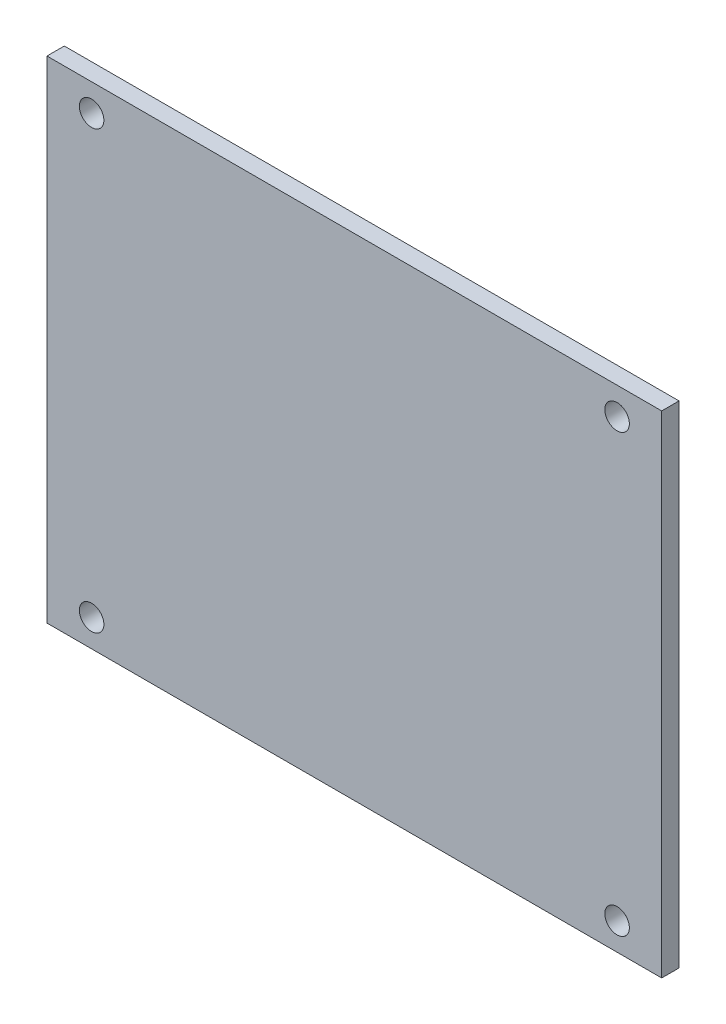
ISO-10303-21;
HEADER;
FILE_DESCRIPTION(('STEP AP214'),'2;1');
FILE_NAME('part.step','',(''),(''),'','','');
FILE_SCHEMA(('AUTOMOTIVE_DESIGN { 1 0 10303 214 1 1 1 1 }'));
ENDSEC;
DATA;
#1=APPLICATION_CONTEXT('core data for automotive mechanical design processes');
#2=APPLICATION_PROTOCOL_DEFINITION('international standard','automotive_design',2000,#1);
#3=PRODUCT_CONTEXT('',#1,'mechanical');
#4=PRODUCT('Part','Part','',(#3));
#5=PRODUCT_RELATED_PRODUCT_CATEGORY('part','',(#4));
#6=PRODUCT_DEFINITION_FORMATION('','',#4);
#7=PRODUCT_DEFINITION_CONTEXT('part definition',#1,'design');
#8=PRODUCT_DEFINITION('design','',#6,#7);
#9=PRODUCT_DEFINITION_SHAPE('','',#8);
#10=(LENGTH_UNIT() NAMED_UNIT(*) SI_UNIT(.MILLI.,.METRE.));
#11=(NAMED_UNIT(*) PLANE_ANGLE_UNIT() SI_UNIT($,.RADIAN.));
#12=(NAMED_UNIT(*) SI_UNIT($,.STERADIAN.) SOLID_ANGLE_UNIT());
#13=UNCERTAINTY_MEASURE_WITH_UNIT(LENGTH_MEASURE(1.E-05),#10,'distance_accuracy_value','');
#14=(GEOMETRIC_REPRESENTATION_CONTEXT(3) GLOBAL_UNCERTAINTY_ASSIGNED_CONTEXT((#13)) GLOBAL_UNIT_ASSIGNED_CONTEXT((#10,
#11,#12)) REPRESENTATION_CONTEXT('',''));
#15=CARTESIAN_POINT('',(0.,0.,0.));
#16=DIRECTION('',(0.,0.,1.));
#17=DIRECTION('',(1.,0.,0.));
#18=AXIS2_PLACEMENT_3D('',#15,#16,#17);
#19=CARTESIAN_POINT('',(0.,0.,3.175));
#20=DIRECTION('',(0.,0.,-1.));
#21=DIRECTION('',(-1.,0.,0.));
#22=AXIS2_PLACEMENT_3D('',#19,#20,#21);
#23=PLANE('',#22);
#24=CARTESIAN_POINT('',(48.15,-40.,3.175));
#25=DIRECTION('',(0.,0.,1.));
#26=DIRECTION('',(1.,0.,0.));
#27=AXIS2_PLACEMENT_3D('',#24,#25,#26);
#28=CIRCLE('',#27,2.24999999999999);
#29=CARTESIAN_POINT('',(50.4,-40.,3.175));
#30=VERTEX_POINT('',#29);
#31=EDGE_CURVE('E147',#30,#30,#28,.T.);
#32=ORIENTED_EDGE('',*,*,#31,.F.);
#33=EDGE_LOOP('',(#32));
#34=FACE_BOUND('',#33,.T.);
#35=CARTESIAN_POINT('',(-48.15,40.,3.175));
#36=DIRECTION('',(0.,0.,1.));
#37=DIRECTION('',(1.,0.,0.));
#38=AXIS2_PLACEMENT_3D('',#35,#36,#37);
#39=CIRCLE('',#38,2.24999999999999);
#40=CARTESIAN_POINT('',(-45.9,40.,3.175));
#41=VERTEX_POINT('',#40);
#42=EDGE_CURVE('E139',#41,#41,#39,.T.);
#43=ORIENTED_EDGE('',*,*,#42,.F.);
#44=EDGE_LOOP('',(#43));
#45=FACE_BOUND('',#44,.T.);
#46=CARTESIAN_POINT('',(-48.15,-40.,3.175));
#47=DIRECTION('',(0.,0.,1.));
#48=DIRECTION('',(1.,0.,0.));
#49=AXIS2_PLACEMENT_3D('',#46,#47,#48);
#50=CIRCLE('',#49,2.24999999999999);
#51=CARTESIAN_POINT('',(-45.9,-40.,3.175));
#52=VERTEX_POINT('',#51);
#53=EDGE_CURVE('E131',#52,#52,#50,.T.);
#54=ORIENTED_EDGE('',*,*,#53,.F.);
#55=EDGE_LOOP('',(#54));
#56=FACE_BOUND('',#55,.T.);
#57=DIRECTION('',(0.,1.,0.));
#58=VECTOR('',#57,1.);
#59=CARTESIAN_POINT('',(56.325,-45.,3.175));
#60=LINE('',#59,#58);
#61=CARTESIAN_POINT('',(56.325,-45.,3.175));
#62=VERTEX_POINT('',#61);
#63=CARTESIAN_POINT('',(56.325,45.,3.175));
#64=VERTEX_POINT('',#63);
#65=EDGE_CURVE('E91',#62,#64,#60,.T.);
#66=ORIENTED_EDGE('',*,*,#65,.T.);
#67=DIRECTION('',(-1.,0.,0.));
#68=VECTOR('',#67,1.);
#69=CARTESIAN_POINT('',(-56.325,45.,3.175));
#70=LINE('',#69,#68);
#71=CARTESIAN_POINT('',(-56.325,45.,3.175));
#72=VERTEX_POINT('',#71);
#73=EDGE_CURVE('E86',#64,#72,#70,.T.);
#74=ORIENTED_EDGE('',*,*,#73,.T.);
#75=DIRECTION('',(0.,-1.,0.));
#76=VECTOR('',#75,1.);
#77=CARTESIAN_POINT('',(-56.325,-45.,3.175));
#78=LINE('',#77,#76);
#79=CARTESIAN_POINT('',(-56.325,-45.,3.175));
#80=VERTEX_POINT('',#79);
#81=EDGE_CURVE('E89',#72,#80,#78,.T.);
#82=ORIENTED_EDGE('',*,*,#81,.T.);
#83=DIRECTION('',(1.,0.,0.));
#84=VECTOR('',#83,1.);
#85=CARTESIAN_POINT('',(-56.325,-45.,3.175));
#86=LINE('',#85,#84);
#87=EDGE_CURVE('E56',#80,#62,#86,.T.);
#88=ORIENTED_EDGE('',*,*,#87,.T.);
#89=EDGE_LOOP('',(#66,#74,#82,#88));
#90=FACE_BOUND('',#89,.T.);
#91=CARTESIAN_POINT('',(48.15,40.,3.175));
#92=DIRECTION('',(0.,0.,1.));
#93=DIRECTION('',(1.,0.,0.));
#94=AXIS2_PLACEMENT_3D('',#91,#92,#93);
#95=CIRCLE('',#94,2.24999999999999);
#96=CARTESIAN_POINT('',(50.4,40.,3.175));
#97=VERTEX_POINT('',#96);
#98=EDGE_CURVE('E155',#97,#97,#95,.T.);
#99=ORIENTED_EDGE('',*,*,#98,.F.);
#100=EDGE_LOOP('',(#99));
#101=FACE_BOUND('',#100,.T.);
#102=ADVANCED_FACE('F38',(#34,#45,#56,#90,#101),#23,.F.);
#103=CARTESIAN_POINT('',(56.325,-45.,3.175));
#104=DIRECTION('',(-1.,0.,0.));
#105=DIRECTION('',(0.,0.,1.));
#106=AXIS2_PLACEMENT_3D('',#103,#104,#105);
#107=PLANE('',#106);
#108=DIRECTION('',(0.,1.,0.));
#109=VECTOR('',#108,1.);
#110=CARTESIAN_POINT('',(56.325,-45.,0.));
#111=LINE('',#110,#109);
#112=CARTESIAN_POINT('',(56.325,-45.,0.));
#113=VERTEX_POINT('',#112);
#114=CARTESIAN_POINT('',(56.325,45.,0.));
#115=VERTEX_POINT('',#114);
#116=EDGE_CURVE('E107',#113,#115,#111,.T.);
#117=ORIENTED_EDGE('',*,*,#116,.T.);
#118=DIRECTION('',(0.,0.,-1.));
#119=VECTOR('',#118,1.);
#120=CARTESIAN_POINT('',(56.325,45.,3.175));
#121=LINE('',#120,#119);
#122=EDGE_CURVE('E11',#64,#115,#121,.T.);
#123=ORIENTED_EDGE('',*,*,#122,.F.);
#124=ORIENTED_EDGE('',*,*,#65,.F.);
#125=DIRECTION('',(0.,0.,-1.));
#126=VECTOR('',#125,1.);
#127=CARTESIAN_POINT('',(56.325,-45.,3.175));
#128=LINE('',#127,#126);
#129=EDGE_CURVE('E103',#62,#113,#128,.T.);
#130=ORIENTED_EDGE('',*,*,#129,.T.);
#131=EDGE_LOOP('',(#117,#123,#124,#130));
#132=FACE_BOUND('',#131,.T.);
#133=ADVANCED_FACE('F40',(#132),#107,.F.);
#134=CARTESIAN_POINT('',(-56.325,45.,3.175));
#135=DIRECTION('',(0.,-1.,0.));
#136=DIRECTION('',(0.,0.,-1.));
#137=AXIS2_PLACEMENT_3D('',#134,#135,#136);
#138=PLANE('',#137);
#139=DIRECTION('',(-1.,0.,0.));
#140=VECTOR('',#139,1.);
#141=CARTESIAN_POINT('',(-56.325,45.,0.));
#142=LINE('',#141,#140);
#143=CARTESIAN_POINT('',(-56.325,45.,0.));
#144=VERTEX_POINT('',#143);
#145=EDGE_CURVE('E96',#115,#144,#142,.T.);
#146=ORIENTED_EDGE('',*,*,#145,.T.);
#147=DIRECTION('',(0.,0.,-1.));
#148=VECTOR('',#147,1.);
#149=CARTESIAN_POINT('',(-56.325,45.,3.175));
#150=LINE('',#149,#148);
#151=EDGE_CURVE('E48',#72,#144,#150,.T.);
#152=ORIENTED_EDGE('',*,*,#151,.F.);
#153=ORIENTED_EDGE('',*,*,#73,.F.);
#154=ORIENTED_EDGE('',*,*,#122,.T.);
#155=EDGE_LOOP('',(#146,#152,#153,#154));
#156=FACE_BOUND('',#155,.T.);
#157=ADVANCED_FACE('F95',(#156),#138,.F.);
#158=CARTESIAN_POINT('',(-56.325,-45.,3.175));
#159=DIRECTION('',(1.,0.,0.));
#160=DIRECTION('',(0.,0.,-1.));
#161=AXIS2_PLACEMENT_3D('',#158,#159,#160);
#162=PLANE('',#161);
#163=DIRECTION('',(0.,-1.,0.));
#164=VECTOR('',#163,1.);
#165=CARTESIAN_POINT('',(-56.325,-45.,0.));
#166=LINE('',#165,#164);
#167=CARTESIAN_POINT('',(-56.325,-45.,0.));
#168=VERTEX_POINT('',#167);
#169=EDGE_CURVE('E73',#144,#168,#166,.T.);
#170=ORIENTED_EDGE('',*,*,#169,.T.);
#171=DIRECTION('',(0.,0.,-1.));
#172=VECTOR('',#171,1.);
#173=CARTESIAN_POINT('',(-56.325,-45.,3.175));
#174=LINE('',#173,#172);
#175=EDGE_CURVE('E98',#80,#168,#174,.T.);
#176=ORIENTED_EDGE('',*,*,#175,.F.);
#177=ORIENTED_EDGE('',*,*,#81,.F.);
#178=ORIENTED_EDGE('',*,*,#151,.T.);
#179=EDGE_LOOP('',(#170,#176,#177,#178));
#180=FACE_BOUND('',#179,.T.);
#181=ADVANCED_FACE('F99',(#180),#162,.F.);
#182=CARTESIAN_POINT('',(-56.325,-45.,3.175));
#183=DIRECTION('',(0.,1.,0.));
#184=DIRECTION('',(0.,0.,1.));
#185=AXIS2_PLACEMENT_3D('',#182,#183,#184);
#186=PLANE('',#185);
#187=DIRECTION('',(1.,0.,0.));
#188=VECTOR('',#187,1.);
#189=CARTESIAN_POINT('',(-56.325,-45.,0.));
#190=LINE('',#189,#188);
#191=EDGE_CURVE('E79',#168,#113,#190,.T.);
#192=ORIENTED_EDGE('',*,*,#191,.T.);
#193=ORIENTED_EDGE('',*,*,#129,.F.);
#194=ORIENTED_EDGE('',*,*,#87,.F.);
#195=ORIENTED_EDGE('',*,*,#175,.T.);
#196=EDGE_LOOP('',(#192,#193,#194,#195));
#197=FACE_BOUND('',#196,.T.);
#198=ADVANCED_FACE('F121',(#197),#186,.F.);
#199=CARTESIAN_POINT('',(0.,0.,0.));
#200=DIRECTION('',(0.,0.,-1.));
#201=DIRECTION('',(-1.,0.,0.));
#202=AXIS2_PLACEMENT_3D('',#199,#200,#201);
#203=PLANE('',#202);
#204=CARTESIAN_POINT('',(48.15,40.,0.));
#205=DIRECTION('',(0.,0.,1.));
#206=DIRECTION('',(1.,0.,0.));
#207=AXIS2_PLACEMENT_3D('',#204,#205,#206);
#208=CIRCLE('',#207,2.25);
#209=CARTESIAN_POINT('',(50.4,40.,0.));
#210=VERTEX_POINT('',#209);
#211=EDGE_CURVE('E151',#210,#210,#208,.T.);
#212=ORIENTED_EDGE('',*,*,#211,.T.);
#213=EDGE_LOOP('',(#212));
#214=FACE_BOUND('',#213,.T.);
#215=CARTESIAN_POINT('',(48.15,-40.,0.));
#216=DIRECTION('',(0.,0.,1.));
#217=DIRECTION('',(1.,0.,0.));
#218=AXIS2_PLACEMENT_3D('',#215,#216,#217);
#219=CIRCLE('',#218,2.25);
#220=CARTESIAN_POINT('',(50.4,-40.,0.));
#221=VERTEX_POINT('',#220);
#222=EDGE_CURVE('E143',#221,#221,#219,.T.);
#223=ORIENTED_EDGE('',*,*,#222,.T.);
#224=EDGE_LOOP('',(#223));
#225=FACE_BOUND('',#224,.T.);
#226=CARTESIAN_POINT('',(-48.15,40.,0.));
#227=DIRECTION('',(0.,0.,1.));
#228=DIRECTION('',(1.,0.,0.));
#229=AXIS2_PLACEMENT_3D('',#226,#227,#228);
#230=CIRCLE('',#229,2.25);
#231=CARTESIAN_POINT('',(-45.9,40.,0.));
#232=VERTEX_POINT('',#231);
#233=EDGE_CURVE('E135',#232,#232,#230,.T.);
#234=ORIENTED_EDGE('',*,*,#233,.T.);
#235=EDGE_LOOP('',(#234));
#236=FACE_BOUND('',#235,.T.);
#237=CARTESIAN_POINT('',(-48.15,-40.,0.));
#238=DIRECTION('',(0.,0.,1.));
#239=DIRECTION('',(1.,0.,0.));
#240=AXIS2_PLACEMENT_3D('',#237,#238,#239);
#241=CIRCLE('',#240,2.25);
#242=CARTESIAN_POINT('',(-45.9,-40.,0.));
#243=VERTEX_POINT('',#242);
#244=EDGE_CURVE('E111',#243,#243,#241,.T.);
#245=ORIENTED_EDGE('',*,*,#244,.T.);
#246=EDGE_LOOP('',(#245));
#247=FACE_BOUND('',#246,.T.);
#248=ORIENTED_EDGE('',*,*,#116,.F.);
#249=ORIENTED_EDGE('',*,*,#191,.F.);
#250=ORIENTED_EDGE('',*,*,#169,.F.);
#251=ORIENTED_EDGE('',*,*,#145,.F.);
#252=EDGE_LOOP('',(#248,#249,#250,#251));
#253=FACE_BOUND('',#252,.T.);
#254=ADVANCED_FACE('F124',(#214,#225,#236,#247,#253),#203,.T.);
#255=CARTESIAN_POINT('',(-48.15,-40.,3.175));
#256=DIRECTION('',(0.,0.,1.));
#257=DIRECTION('',(1.,0.,0.));
#258=AXIS2_PLACEMENT_3D('',#255,#256,#257);
#259=CYLINDRICAL_SURFACE('',#258,2.25);
#260=ORIENTED_EDGE('',*,*,#244,.F.);
#261=EDGE_LOOP('',(#260));
#262=FACE_BOUND('',#261,.T.);
#263=ORIENTED_EDGE('',*,*,#53,.T.);
#264=EDGE_LOOP('',(#263));
#265=FACE_BOUND('',#264,.T.);
#266=ADVANCED_FACE('F173',(#262,#265),#259,.F.);
#267=CARTESIAN_POINT('',(-48.15,40.,3.175));
#268=DIRECTION('',(0.,0.,1.));
#269=DIRECTION('',(1.,0.,0.));
#270=AXIS2_PLACEMENT_3D('',#267,#268,#269);
#271=CYLINDRICAL_SURFACE('',#270,2.25);
#272=ORIENTED_EDGE('',*,*,#233,.F.);
#273=EDGE_LOOP('',(#272));
#274=FACE_BOUND('',#273,.T.);
#275=ORIENTED_EDGE('',*,*,#42,.T.);
#276=EDGE_LOOP('',(#275));
#277=FACE_BOUND('',#276,.T.);
#278=ADVANCED_FACE('F211',(#274,#277),#271,.F.);
#279=CARTESIAN_POINT('',(48.15,-40.,3.175));
#280=DIRECTION('',(0.,0.,1.));
#281=DIRECTION('',(1.,0.,0.));
#282=AXIS2_PLACEMENT_3D('',#279,#280,#281);
#283=CYLINDRICAL_SURFACE('',#282,2.25);
#284=ORIENTED_EDGE('',*,*,#222,.F.);
#285=EDGE_LOOP('',(#284));
#286=FACE_BOUND('',#285,.T.);
#287=ORIENTED_EDGE('',*,*,#31,.T.);
#288=EDGE_LOOP('',(#287));
#289=FACE_BOUND('',#288,.T.);
#290=ADVANCED_FACE('F216',(#286,#289),#283,.F.);
#291=CARTESIAN_POINT('',(48.15,40.,3.175));
#292=DIRECTION('',(0.,0.,1.));
#293=DIRECTION('',(1.,0.,0.));
#294=AXIS2_PLACEMENT_3D('',#291,#292,#293);
#295=CYLINDRICAL_SURFACE('',#294,2.25);
#296=ORIENTED_EDGE('',*,*,#211,.F.);
#297=EDGE_LOOP('',(#296));
#298=FACE_BOUND('',#297,.T.);
#299=ORIENTED_EDGE('',*,*,#98,.T.);
#300=EDGE_LOOP('',(#299));
#301=FACE_BOUND('',#300,.T.);
#302=ADVANCED_FACE('F160',(#298,#301),#295,.F.);
#303=CLOSED_SHELL('',(#102,#133,#157,#181,#198,#254,#266,#278,#290,#302));
#304=MANIFOLD_SOLID_BREP('B2',#303);
#305=ADVANCED_BREP_SHAPE_REPRESENTATION('',(#18,#304),#14);
#306=SHAPE_DEFINITION_REPRESENTATION(#9,#305);
ENDSEC;
END-ISO-10303-21;
